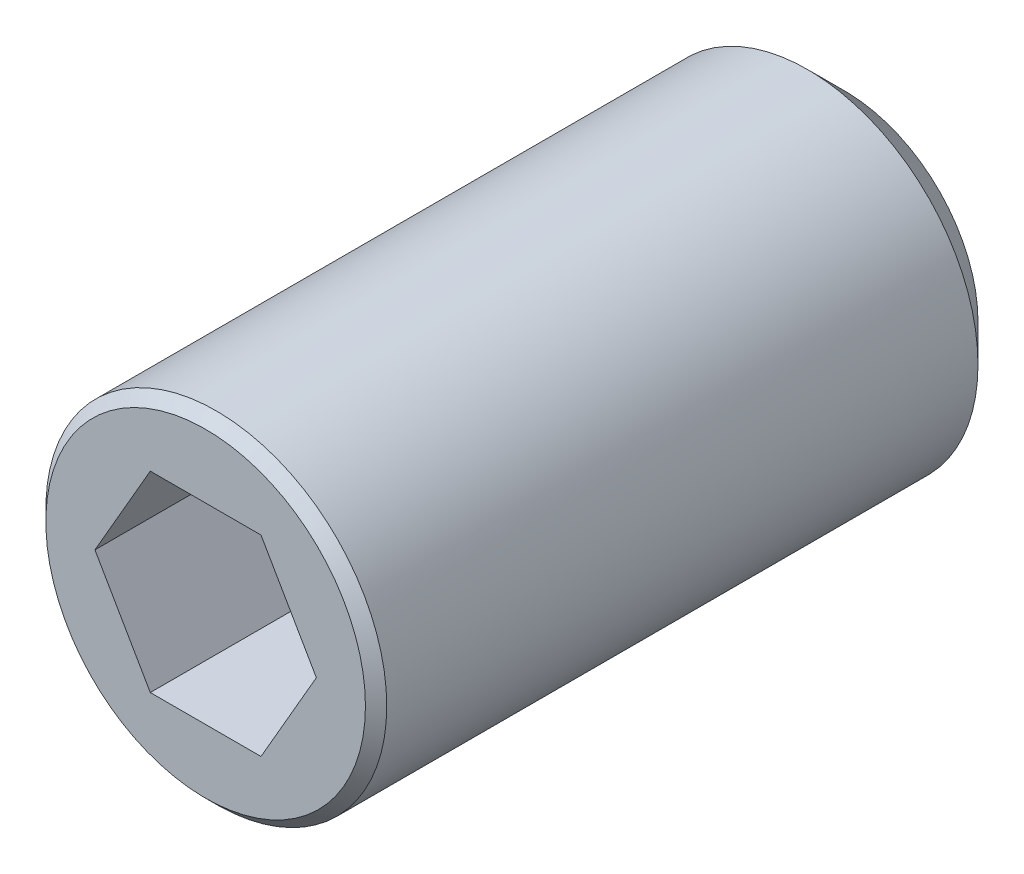
ISO-10303-21;
HEADER;
FILE_DESCRIPTION(('STEP AP214'),'2;1');
FILE_NAME('part.step','',(''),(''),'','','');
FILE_SCHEMA(('AUTOMOTIVE_DESIGN { 1 0 10303 214 1 1 1 1 }'));
ENDSEC;
DATA;
#1=APPLICATION_CONTEXT('core data for automotive mechanical design processes');
#2=APPLICATION_PROTOCOL_DEFINITION('international standard','automotive_design',2000,#1);
#3=PRODUCT_CONTEXT('',#1,'mechanical');
#4=PRODUCT('Part','Part','',(#3));
#5=PRODUCT_RELATED_PRODUCT_CATEGORY('part','',(#4));
#6=PRODUCT_DEFINITION_FORMATION('','',#4);
#7=PRODUCT_DEFINITION_CONTEXT('part definition',#1,'design');
#8=PRODUCT_DEFINITION('design','',#6,#7);
#9=PRODUCT_DEFINITION_SHAPE('','',#8);
#10=(LENGTH_UNIT() NAMED_UNIT(*) SI_UNIT(.MILLI.,.METRE.));
#11=(NAMED_UNIT(*) PLANE_ANGLE_UNIT() SI_UNIT($,.RADIAN.));
#12=(NAMED_UNIT(*) SI_UNIT($,.STERADIAN.) SOLID_ANGLE_UNIT());
#13=UNCERTAINTY_MEASURE_WITH_UNIT(LENGTH_MEASURE(1.E-05),#10,'distance_accuracy_value','');
#14=(GEOMETRIC_REPRESENTATION_CONTEXT(3) GLOBAL_UNCERTAINTY_ASSIGNED_CONTEXT((#13)) GLOBAL_UNIT_ASSIGNED_CONTEXT((#10,
#11,#12)) REPRESENTATION_CONTEXT('',''));
#15=CARTESIAN_POINT('',(0.,0.,0.));
#16=DIRECTION('',(0.,0.,1.));
#17=DIRECTION('',(1.,0.,0.));
#18=AXIS2_PLACEMENT_3D('',#15,#16,#17);
#19=CARTESIAN_POINT('',(0.,0.,15.));
#20=DIRECTION('',(0.,0.,-1.));
#21=DIRECTION('',(-1.,0.,0.));
#22=AXIS2_PLACEMENT_3D('',#19,#20,#21);
#23=CYLINDRICAL_SURFACE('',#22,8.);
#24=CARTESIAN_POINT('',(0.,0.,14.5));
#25=DIRECTION('',(0.,0.,1.));
#26=DIRECTION('',(1.,0.,0.));
#27=AXIS2_PLACEMENT_3D('',#24,#25,#26);
#28=CIRCLE('',#27,8.);
#29=CARTESIAN_POINT('',(8.,0.,14.5));
#30=VERTEX_POINT('',#29);
#31=EDGE_CURVE('E11',#30,#30,#28,.F.);
#32=ORIENTED_EDGE('',*,*,#31,.T.);
#33=EDGE_LOOP('',(#32));
#34=FACE_BOUND('',#33,.T.);
#35=CARTESIAN_POINT('',(0.,0.,-13.25));
#36=DIRECTION('',(0.,0.,1.));
#37=DIRECTION('',(1.,0.,0.));
#38=AXIS2_PLACEMENT_3D('',#35,#36,#37);
#39=CIRCLE('',#38,8.);
#40=CARTESIAN_POINT('',(8.,0.,-13.25));
#41=VERTEX_POINT('',#40);
#42=EDGE_CURVE('E118',#41,#41,#39,.T.);
#43=ORIENTED_EDGE('',*,*,#42,.T.);
#44=EDGE_LOOP('',(#43));
#45=FACE_BOUND('',#44,.T.);
#46=ADVANCED_FACE('F43',(#34,#45),#23,.T.);
#47=CARTESIAN_POINT('',(0.,0.,15.));
#48=DIRECTION('',(0.,0.,1.));
#49=DIRECTION('',(1.,0.,0.));
#50=AXIS2_PLACEMENT_3D('',#47,#48,#49);
#51=PLANE('',#50);
#52=CARTESIAN_POINT('',(0.,0.,15.));
#53=DIRECTION('',(0.,0.,1.));
#54=DIRECTION('',(1.,0.,0.));
#55=AXIS2_PLACEMENT_3D('',#52,#53,#54);
#56=CIRCLE('',#55,7.49999999999999);
#57=CARTESIAN_POINT('',(7.49999999999999,0.,15.));
#58=VERTEX_POINT('',#57);
#59=EDGE_CURVE('E51',#58,#58,#56,.T.);
#60=ORIENTED_EDGE('',*,*,#59,.T.);
#61=EDGE_LOOP('',(#60));
#62=FACE_BOUND('',#61,.T.);
#63=DIRECTION('',(-0.5,0.866025403784439,0.));
#64=VECTOR('',#63,1.);
#65=CARTESIAN_POINT('',(5.19615242270663,0.,15.));
#66=LINE('',#65,#64);
#67=CARTESIAN_POINT('',(5.19615242270663,0.,15.));
#68=VERTEX_POINT('',#67);
#69=CARTESIAN_POINT('',(2.59807621135332,4.5,15.));
#70=VERTEX_POINT('',#69);
#71=EDGE_CURVE('E58',#68,#70,#66,.T.);
#72=ORIENTED_EDGE('',*,*,#71,.F.);
#73=DIRECTION('',(0.5,0.866025403784439,0.));
#74=VECTOR('',#73,1.);
#75=CARTESIAN_POINT('',(2.59807621135332,-4.5,15.));
#76=LINE('',#75,#74);
#77=CARTESIAN_POINT('',(2.59807621135332,-4.5,15.));
#78=VERTEX_POINT('',#77);
#79=EDGE_CURVE('E93',#78,#68,#76,.T.);
#80=ORIENTED_EDGE('',*,*,#79,.F.);
#81=DIRECTION('',(1.,0.,0.));
#82=VECTOR('',#81,1.);
#83=CARTESIAN_POINT('',(-2.59807621135332,-4.5,15.));
#84=LINE('',#83,#82);
#85=CARTESIAN_POINT('',(-2.59807621135332,-4.5,15.));
#86=VERTEX_POINT('',#85);
#87=EDGE_CURVE('E101',#86,#78,#84,.T.);
#88=ORIENTED_EDGE('',*,*,#87,.F.);
#89=DIRECTION('',(0.5,-0.866025403784439,0.));
#90=VECTOR('',#89,1.);
#91=CARTESIAN_POINT('',(-5.19615242270663,0.,15.));
#92=LINE('',#91,#90);
#93=CARTESIAN_POINT('',(-5.19615242270663,0.,15.));
#94=VERTEX_POINT('',#93);
#95=EDGE_CURVE('E107',#94,#86,#92,.T.);
#96=ORIENTED_EDGE('',*,*,#95,.F.);
#97=DIRECTION('',(-0.5,-0.866025403784439,0.));
#98=VECTOR('',#97,1.);
#99=CARTESIAN_POINT('',(-2.59807621135332,4.5,15.));
#100=LINE('',#99,#98);
#101=CARTESIAN_POINT('',(-2.59807621135332,4.5,15.));
#102=VERTEX_POINT('',#101);
#103=EDGE_CURVE('E376',#102,#94,#100,.T.);
#104=ORIENTED_EDGE('',*,*,#103,.F.);
#105=DIRECTION('',(-1.,0.,0.));
#106=VECTOR('',#105,1.);
#107=CARTESIAN_POINT('',(2.59807621135332,4.5,15.));
#108=LINE('',#107,#106);
#109=EDGE_CURVE('E359',#70,#102,#108,.T.);
#110=ORIENTED_EDGE('',*,*,#109,.F.);
#111=EDGE_LOOP('',(#72,#80,#88,#96,#104,#110));
#112=FACE_BOUND('',#111,.T.);
#113=ADVANCED_FACE('F109',(#62,#112),#51,.T.);
#114=CARTESIAN_POINT('',(0.,0.,-15.));
#115=DIRECTION('',(0.,0.,1.));
#116=DIRECTION('',(1.,0.,0.));
#117=AXIS2_PLACEMENT_3D('',#114,#115,#116);
#118=PLANE('',#117);
#119=CARTESIAN_POINT('',(0.,0.,-15.));
#120=DIRECTION('',(0.,0.,1.));
#121=DIRECTION('',(1.,0.,0.));
#122=AXIS2_PLACEMENT_3D('',#119,#120,#121);
#123=CIRCLE('',#122,6.24999999999999);
#124=CARTESIAN_POINT('',(6.24999999999999,0.,-15.));
#125=VERTEX_POINT('',#124);
#126=EDGE_CURVE('E129',#125,#125,#123,.F.);
#127=ORIENTED_EDGE('',*,*,#126,.T.);
#128=EDGE_LOOP('',(#127));
#129=FACE_BOUND('',#128,.T.);
#130=ADVANCED_FACE('F151',(#129),#118,.F.);
#131=CARTESIAN_POINT('',(0.,0.,-13.25));
#132=DIRECTION('',(0.,0.,1.));
#133=DIRECTION('',(1.,0.,0.));
#134=AXIS2_PLACEMENT_3D('',#131,#132,#133);
#135=CONICAL_SURFACE('',#134,8.,0.785398163397443);
#136=ORIENTED_EDGE('',*,*,#126,.F.);
#137=EDGE_LOOP('',(#136));
#138=FACE_BOUND('',#137,.T.);
#139=ORIENTED_EDGE('',*,*,#42,.F.);
#140=EDGE_LOOP('',(#139));
#141=FACE_BOUND('',#140,.T.);
#142=ADVANCED_FACE('F155',(#138,#141),#135,.T.);
#143=CARTESIAN_POINT('',(5.19615242270663,0.,7.));
#144=DIRECTION('',(0.866025403784439,0.5,0.));
#145=DIRECTION('',(-0.5,0.866025403784439,0.));
#146=AXIS2_PLACEMENT_3D('',#143,#144,#145);
#147=PLANE('',#146);
#148=ORIENTED_EDGE('',*,*,#71,.T.);
#149=DIRECTION('',(0.,0.,1.));
#150=VECTOR('',#149,1.);
#151=CARTESIAN_POINT('',(2.59807621135332,4.5,7.));
#152=LINE('',#151,#150);
#153=CARTESIAN_POINT('',(2.59807621135332,4.5,7.));
#154=VERTEX_POINT('',#153);
#155=EDGE_CURVE('E125',#154,#70,#152,.T.);
#156=ORIENTED_EDGE('',*,*,#155,.F.);
#157=DIRECTION('',(-0.5,0.866025403784439,0.));
#158=VECTOR('',#157,1.);
#159=CARTESIAN_POINT('',(5.19615242270663,0.,7.));
#160=LINE('',#159,#158);
#161=CARTESIAN_POINT('',(5.19615242270663,0.,7.));
#162=VERTEX_POINT('',#161);
#163=EDGE_CURVE('E111',#162,#154,#160,.T.);
#164=ORIENTED_EDGE('',*,*,#163,.F.);
#165=DIRECTION('',(0.,0.,1.));
#166=VECTOR('',#165,1.);
#167=CARTESIAN_POINT('',(5.19615242270663,0.,7.));
#168=LINE('',#167,#166);
#169=EDGE_CURVE('E97',#162,#68,#168,.T.);
#170=ORIENTED_EDGE('',*,*,#169,.T.);
#171=EDGE_LOOP('',(#148,#156,#164,#170));
#172=FACE_BOUND('',#171,.T.);
#173=ADVANCED_FACE('F157',(#172),#147,.F.);
#174=CARTESIAN_POINT('',(2.59807621135332,-4.5,7.));
#175=DIRECTION('',(0.866025403784439,-0.5,0.));
#176=DIRECTION('',(0.5,0.866025403784439,0.));
#177=AXIS2_PLACEMENT_3D('',#174,#175,#176);
#178=PLANE('',#177);
#179=ORIENTED_EDGE('',*,*,#79,.T.);
#180=ORIENTED_EDGE('',*,*,#169,.F.);
#181=DIRECTION('',(0.5,0.866025403784439,0.));
#182=VECTOR('',#181,1.);
#183=CARTESIAN_POINT('',(2.59807621135332,-4.5,7.));
#184=LINE('',#183,#182);
#185=CARTESIAN_POINT('',(2.59807621135332,-4.5,7.));
#186=VERTEX_POINT('',#185);
#187=EDGE_CURVE('E95',#186,#162,#184,.T.);
#188=ORIENTED_EDGE('',*,*,#187,.F.);
#189=DIRECTION('',(0.,0.,1.));
#190=VECTOR('',#189,1.);
#191=CARTESIAN_POINT('',(2.59807621135332,-4.5,7.));
#192=LINE('',#191,#190);
#193=EDGE_CURVE('E88',#186,#78,#192,.T.);
#194=ORIENTED_EDGE('',*,*,#193,.T.);
#195=EDGE_LOOP('',(#179,#180,#188,#194));
#196=FACE_BOUND('',#195,.T.);
#197=ADVANCED_FACE('F90',(#196),#178,.F.);
#198=CARTESIAN_POINT('',(-2.59807621135332,-4.5,7.));
#199=DIRECTION('',(0.,-1.,0.));
#200=DIRECTION('',(1.,0.,0.));
#201=AXIS2_PLACEMENT_3D('',#198,#199,#200);
#202=PLANE('',#201);
#203=ORIENTED_EDGE('',*,*,#87,.T.);
#204=ORIENTED_EDGE('',*,*,#193,.F.);
#205=DIRECTION('',(1.,0.,0.));
#206=VECTOR('',#205,1.);
#207=CARTESIAN_POINT('',(-2.59807621135332,-4.5,7.));
#208=LINE('',#207,#206);
#209=CARTESIAN_POINT('',(-2.59807621135332,-4.5,7.));
#210=VERTEX_POINT('',#209);
#211=EDGE_CURVE('E67',#210,#186,#208,.T.);
#212=ORIENTED_EDGE('',*,*,#211,.F.);
#213=DIRECTION('',(0.,0.,1.));
#214=VECTOR('',#213,1.);
#215=CARTESIAN_POINT('',(-2.59807621135332,-4.5,7.));
#216=LINE('',#215,#214);
#217=EDGE_CURVE('E98',#210,#86,#216,.T.);
#218=ORIENTED_EDGE('',*,*,#217,.T.);
#219=EDGE_LOOP('',(#203,#204,#212,#218));
#220=FACE_BOUND('',#219,.T.);
#221=ADVANCED_FACE('F102',(#220),#202,.F.);
#222=CARTESIAN_POINT('',(-5.19615242270663,0.,7.));
#223=DIRECTION('',(-0.866025403784439,-0.5,0.));
#224=DIRECTION('',(0.5,-0.866025403784439,0.));
#225=AXIS2_PLACEMENT_3D('',#222,#223,#224);
#226=PLANE('',#225);
#227=ORIENTED_EDGE('',*,*,#95,.T.);
#228=ORIENTED_EDGE('',*,*,#217,.F.);
#229=DIRECTION('',(0.5,-0.866025403784439,0.));
#230=VECTOR('',#229,1.);
#231=CARTESIAN_POINT('',(-5.19615242270663,0.,7.));
#232=LINE('',#231,#230);
#233=CARTESIAN_POINT('',(-5.19615242270663,0.,7.));
#234=VERTEX_POINT('',#233);
#235=EDGE_CURVE('E366',#234,#210,#232,.T.);
#236=ORIENTED_EDGE('',*,*,#235,.F.);
#237=DIRECTION('',(0.,0.,1.));
#238=VECTOR('',#237,1.);
#239=CARTESIAN_POINT('',(-5.19615242270663,0.,7.));
#240=LINE('',#239,#238);
#241=EDGE_CURVE('E121',#234,#94,#240,.T.);
#242=ORIENTED_EDGE('',*,*,#241,.T.);
#243=EDGE_LOOP('',(#227,#228,#236,#242));
#244=FACE_BOUND('',#243,.T.);
#245=ADVANCED_FACE('F203',(#244),#226,.F.);
#246=CARTESIAN_POINT('',(-2.59807621135332,4.5,7.));
#247=DIRECTION('',(-0.866025403784439,0.5,0.));
#248=DIRECTION('',(-0.5,-0.866025403784439,0.));
#249=AXIS2_PLACEMENT_3D('',#246,#247,#248);
#250=PLANE('',#249);
#251=ORIENTED_EDGE('',*,*,#103,.T.);
#252=ORIENTED_EDGE('',*,*,#241,.F.);
#253=DIRECTION('',(-0.5,-0.866025403784439,0.));
#254=VECTOR('',#253,1.);
#255=CARTESIAN_POINT('',(-2.59807621135332,4.5,7.));
#256=LINE('',#255,#254);
#257=CARTESIAN_POINT('',(-2.59807621135332,4.5,7.));
#258=VERTEX_POINT('',#257);
#259=EDGE_CURVE('E355',#258,#234,#256,.T.);
#260=ORIENTED_EDGE('',*,*,#259,.F.);
#261=DIRECTION('',(0.,0.,1.));
#262=VECTOR('',#261,1.);
#263=CARTESIAN_POINT('',(-2.59807621135332,4.5,7.));
#264=LINE('',#263,#262);
#265=EDGE_CURVE('E123',#258,#102,#264,.T.);
#266=ORIENTED_EDGE('',*,*,#265,.T.);
#267=EDGE_LOOP('',(#251,#252,#260,#266));
#268=FACE_BOUND('',#267,.T.);
#269=ADVANCED_FACE('F212',(#268),#250,.F.);
#270=CARTESIAN_POINT('',(2.59807621135332,4.5,7.));
#271=DIRECTION('',(0.,1.,0.));
#272=DIRECTION('',(-1.,0.,0.));
#273=AXIS2_PLACEMENT_3D('',#270,#271,#272);
#274=PLANE('',#273);
#275=ORIENTED_EDGE('',*,*,#109,.T.);
#276=ORIENTED_EDGE('',*,*,#265,.F.);
#277=DIRECTION('',(-1.,0.,0.));
#278=VECTOR('',#277,1.);
#279=CARTESIAN_POINT('',(2.59807621135332,4.5,7.));
#280=LINE('',#279,#278);
#281=EDGE_CURVE('E114',#154,#258,#280,.T.);
#282=ORIENTED_EDGE('',*,*,#281,.F.);
#283=ORIENTED_EDGE('',*,*,#155,.T.);
#284=EDGE_LOOP('',(#275,#276,#282,#283));
#285=FACE_BOUND('',#284,.T.);
#286=ADVANCED_FACE('F222',(#285),#274,.F.);
#287=CARTESIAN_POINT('',(-2.59807621135332,-4.5,7.));
#288=CARTESIAN_POINT('',(-2.46817240078565,-4.275,6.5));
#289=CARTESIAN_POINT('',(0.,0.,6.5));
#290=CARTESIAN_POINT('',(2.59807621135332,-4.5,7.));
#291=CARTESIAN_POINT('',(2.46817240078565,-4.275,6.5));
#292=CARTESIAN_POINT('',(0.,0.,6.5));
#293=(BOUNDED_SURFACE() B_SPLINE_SURFACE(1,2,((#287,#288,#289),(#290,#291,#292)),.UNSPECIFIED.,
.F.,.F.,.F.) B_SPLINE_SURFACE_WITH_KNOTS((2,2),(3,3),(0.,1.),(0.,1.),
.UNSPECIFIED.) GEOMETRIC_REPRESENTATION_ITEM() RATIONAL_B_SPLINE_SURFACE(((1.,1.,1.),(1.,1.,1.))) REPRESENTATION_ITEM('') SURFACE());
#294=CARTESIAN_POINT('',(2.59807621135332,-4.5,7.));
#295=CARTESIAN_POINT('',(2.46817240078565,-4.275,6.5));
#296=CARTESIAN_POINT('',(0.,0.,6.5));
#297=(BOUNDED_CURVE() B_SPLINE_CURVE(2,(#294,#295,#296),.UNSPECIFIED.,.F.,
.F.) B_SPLINE_CURVE_WITH_KNOTS((3,3),(0.,1.),
.UNSPECIFIED.) CURVE() GEOMETRIC_REPRESENTATION_ITEM() RATIONAL_B_SPLINE_CURVE((1.,1.,1.)) REPRESENTATION_ITEM(''));
#298=CARTESIAN_POINT('',(0.,0.,6.5));
#299=VERTEX_POINT('',#298);
#300=EDGE_CURVE('E374',#186,#299,#297,.T.);
#301=CARTESIAN_POINT('',(-2.59807621135332,-4.5,7.));
#302=CARTESIAN_POINT('',(-2.46817240078565,-4.275,6.5));
#303=CARTESIAN_POINT('',(0.,0.,6.5));
#304=(BOUNDED_CURVE() B_SPLINE_CURVE(2,(#301,#302,#303),.UNSPECIFIED.,.F.,
.F.) B_SPLINE_CURVE_WITH_KNOTS((3,3),(0.,1.),
.UNSPECIFIED.) CURVE() GEOMETRIC_REPRESENTATION_ITEM() RATIONAL_B_SPLINE_CURVE((1.,1.,1.)) REPRESENTATION_ITEM(''));
#305=EDGE_CURVE('E381',#210,#299,#304,.T.);
#306=ORIENTED_EDGE('',*,*,#211,.T.);
#307=ORIENTED_EDGE('',*,*,#300,.T.);
#308=ORIENTED_EDGE('',*,*,#305,.F.);
#309=EDGE_LOOP('',(#306,#307,#308));
#310=FACE_BOUND('',#309,.T.);
#311=ADVANCED_FACE('F232',(#310),#293,.T.);
#312=CARTESIAN_POINT('',(-5.19615242270663,0.,7.));
#313=CARTESIAN_POINT('',(-4.9363448015713,0.,6.5));
#314=CARTESIAN_POINT('',(0.,0.,6.5));
#315=CARTESIAN_POINT('',(-2.59807621135332,-4.5,7.));
#316=CARTESIAN_POINT('',(-2.46817240078565,-4.275,6.5));
#317=CARTESIAN_POINT('',(0.,0.,6.5));
#318=(BOUNDED_SURFACE() B_SPLINE_SURFACE(1,2,((#312,#313,#314),(#315,#316,#317)),.UNSPECIFIED.,
.F.,.F.,.F.) B_SPLINE_SURFACE_WITH_KNOTS((2,2),(3,3),(0.,1.),(0.,1.),
.UNSPECIFIED.) GEOMETRIC_REPRESENTATION_ITEM() RATIONAL_B_SPLINE_SURFACE(((1.,1.,1.),(1.,1.,1.))) REPRESENTATION_ITEM('') SURFACE());
#319=CARTESIAN_POINT('',(-5.19615242270663,0.,7.));
#320=CARTESIAN_POINT('',(-4.9363448015713,0.,6.5));
#321=CARTESIAN_POINT('',(0.,0.,6.5));
#322=(BOUNDED_CURVE() B_SPLINE_CURVE(2,(#319,#320,#321),.UNSPECIFIED.,.F.,
.F.) B_SPLINE_CURVE_WITH_KNOTS((3,3),(0.,1.),
.UNSPECIFIED.) CURVE() GEOMETRIC_REPRESENTATION_ITEM() RATIONAL_B_SPLINE_CURVE((1.,1.,1.)) REPRESENTATION_ITEM(''));
#323=EDGE_CURVE('E382',#234,#299,#322,.T.);
#324=ORIENTED_EDGE('',*,*,#235,.T.);
#325=ORIENTED_EDGE('',*,*,#305,.T.);
#326=ORIENTED_EDGE('',*,*,#323,.F.);
#327=EDGE_LOOP('',(#324,#325,#326));
#328=FACE_BOUND('',#327,.T.);
#329=ADVANCED_FACE('F242',(#328),#318,.T.);
#330=CARTESIAN_POINT('',(-2.59807621135332,4.5,7.));
#331=CARTESIAN_POINT('',(-2.46817240078565,4.275,6.5));
#332=CARTESIAN_POINT('',(0.,0.,6.5));
#333=CARTESIAN_POINT('',(-5.19615242270663,0.,7.));
#334=CARTESIAN_POINT('',(-4.9363448015713,0.,6.5));
#335=CARTESIAN_POINT('',(0.,0.,6.5));
#336=(BOUNDED_SURFACE() B_SPLINE_SURFACE(1,2,((#330,#331,#332),(#333,#334,#335)),.UNSPECIFIED.,
.F.,.F.,.F.) B_SPLINE_SURFACE_WITH_KNOTS((2,2),(3,3),(0.,1.),(0.,1.),
.UNSPECIFIED.) GEOMETRIC_REPRESENTATION_ITEM() RATIONAL_B_SPLINE_SURFACE(((1.,1.,1.),(1.,1.,1.))) REPRESENTATION_ITEM('') SURFACE());
#337=CARTESIAN_POINT('',(-2.59807621135332,4.5,7.));
#338=CARTESIAN_POINT('',(-2.46817240078565,4.275,6.5));
#339=CARTESIAN_POINT('',(0.,0.,6.5));
#340=(BOUNDED_CURVE() B_SPLINE_CURVE(2,(#337,#338,#339),.UNSPECIFIED.,.F.,
.F.) B_SPLINE_CURVE_WITH_KNOTS((3,3),(0.,1.),
.UNSPECIFIED.) CURVE() GEOMETRIC_REPRESENTATION_ITEM() RATIONAL_B_SPLINE_CURVE((1.,1.,1.)) REPRESENTATION_ITEM(''));
#341=EDGE_CURVE('E349',#258,#299,#340,.T.);
#342=ORIENTED_EDGE('',*,*,#259,.T.);
#343=ORIENTED_EDGE('',*,*,#323,.T.);
#344=ORIENTED_EDGE('',*,*,#341,.F.);
#345=EDGE_LOOP('',(#342,#343,#344));
#346=FACE_BOUND('',#345,.T.);
#347=ADVANCED_FACE('F251',(#346),#336,.T.);
#348=CARTESIAN_POINT('',(2.59807621135332,-4.5,7.));
#349=CARTESIAN_POINT('',(2.46817240078565,-4.275,6.5));
#350=CARTESIAN_POINT('',(0.,0.,6.5));
#351=CARTESIAN_POINT('',(5.19615242270663,0.,7.));
#352=CARTESIAN_POINT('',(4.9363448015713,0.,6.5));
#353=CARTESIAN_POINT('',(0.,0.,6.5));
#354=(BOUNDED_SURFACE() B_SPLINE_SURFACE(1,2,((#348,#349,#350),(#351,#352,#353)),.UNSPECIFIED.,
.F.,.F.,.F.) B_SPLINE_SURFACE_WITH_KNOTS((2,2),(3,3),(0.,1.),(0.,1.),
.UNSPECIFIED.) GEOMETRIC_REPRESENTATION_ITEM() RATIONAL_B_SPLINE_SURFACE(((1.,1.,1.),(1.,1.,1.))) REPRESENTATION_ITEM('') SURFACE());
#355=CARTESIAN_POINT('',(5.19615242270663,0.,7.));
#356=CARTESIAN_POINT('',(4.9363448015713,0.,6.5));
#357=CARTESIAN_POINT('',(0.,0.,6.5));
#358=(BOUNDED_CURVE() B_SPLINE_CURVE(2,(#355,#356,#357),.UNSPECIFIED.,.F.,
.F.) B_SPLINE_CURVE_WITH_KNOTS((3,3),(0.,1.),
.UNSPECIFIED.) CURVE() GEOMETRIC_REPRESENTATION_ITEM() RATIONAL_B_SPLINE_CURVE((1.,1.,1.)) REPRESENTATION_ITEM(''));
#359=EDGE_CURVE('E388',#299,#162,#358,.F.);
#360=ORIENTED_EDGE('',*,*,#187,.T.);
#361=ORIENTED_EDGE('',*,*,#359,.F.);
#362=ORIENTED_EDGE('',*,*,#300,.F.);
#363=EDGE_LOOP('',(#360,#361,#362));
#364=FACE_BOUND('',#363,.T.);
#365=ADVANCED_FACE('F261',(#364),#354,.T.);
#366=CARTESIAN_POINT('',(2.59807621135332,4.5,7.));
#367=CARTESIAN_POINT('',(2.46817240078565,4.275,6.5));
#368=CARTESIAN_POINT('',(0.,0.,6.5));
#369=CARTESIAN_POINT('',(-2.59807621135332,4.5,7.));
#370=CARTESIAN_POINT('',(-2.46817240078565,4.275,6.5));
#371=CARTESIAN_POINT('',(0.,0.,6.5));
#372=(BOUNDED_SURFACE() B_SPLINE_SURFACE(1,2,((#366,#367,#368),(#369,#370,#371)),.UNSPECIFIED.,
.F.,.F.,.F.) B_SPLINE_SURFACE_WITH_KNOTS((2,2),(3,3),(0.,1.),(0.,1.),
.UNSPECIFIED.) GEOMETRIC_REPRESENTATION_ITEM() RATIONAL_B_SPLINE_SURFACE(((1.,1.,1.),(1.,1.,1.))) REPRESENTATION_ITEM('') SURFACE());
#373=CARTESIAN_POINT('',(2.59807621135332,4.5,7.));
#374=CARTESIAN_POINT('',(2.46817240078565,4.275,6.5));
#375=CARTESIAN_POINT('',(0.,0.,6.5));
#376=(BOUNDED_CURVE() B_SPLINE_CURVE(2,(#373,#374,#375),.UNSPECIFIED.,.F.,
.F.) B_SPLINE_CURVE_WITH_KNOTS((3,3),(0.,1.),
.UNSPECIFIED.) CURVE() GEOMETRIC_REPRESENTATION_ITEM() RATIONAL_B_SPLINE_CURVE((1.,1.,1.)) REPRESENTATION_ITEM(''));
#377=EDGE_CURVE('E352',#154,#299,#376,.T.);
#378=ORIENTED_EDGE('',*,*,#281,.T.);
#379=ORIENTED_EDGE('',*,*,#341,.T.);
#380=ORIENTED_EDGE('',*,*,#377,.F.);
#381=EDGE_LOOP('',(#378,#379,#380));
#382=FACE_BOUND('',#381,.T.);
#383=ADVANCED_FACE('F142',(#382),#372,.T.);
#384=CARTESIAN_POINT('',(5.19615242270663,0.,7.));
#385=CARTESIAN_POINT('',(4.9363448015713,0.,6.5));
#386=CARTESIAN_POINT('',(0.,0.,6.5));
#387=CARTESIAN_POINT('',(2.59807621135332,4.5,7.));
#388=CARTESIAN_POINT('',(2.46817240078565,4.275,6.5));
#389=CARTESIAN_POINT('',(0.,0.,6.5));
#390=(BOUNDED_SURFACE() B_SPLINE_SURFACE(1,2,((#384,#385,#386),(#387,#388,#389)),.UNSPECIFIED.,
.F.,.F.,.F.) B_SPLINE_SURFACE_WITH_KNOTS((2,2),(3,3),(0.,1.),(0.,1.),
.UNSPECIFIED.) GEOMETRIC_REPRESENTATION_ITEM() RATIONAL_B_SPLINE_SURFACE(((1.,1.,1.),(1.,1.,1.))) REPRESENTATION_ITEM('') SURFACE());
#391=ORIENTED_EDGE('',*,*,#163,.T.);
#392=ORIENTED_EDGE('',*,*,#377,.T.);
#393=ORIENTED_EDGE('',*,*,#359,.T.);
#394=EDGE_LOOP('',(#391,#392,#393));
#395=FACE_BOUND('',#394,.T.);
#396=ADVANCED_FACE('F136',(#395),#390,.T.);
#397=CARTESIAN_POINT('',(0.,0.,15.));
#398=DIRECTION('',(0.,0.,-1.));
#399=DIRECTION('',(-1.,0.,0.));
#400=AXIS2_PLACEMENT_3D('',#397,#398,#399);
#401=CONICAL_SURFACE('',#400,7.49999999999999,0.785398163397453);
#402=ORIENTED_EDGE('',*,*,#31,.F.);
#403=EDGE_LOOP('',(#402));
#404=FACE_BOUND('',#403,.T.);
#405=ORIENTED_EDGE('',*,*,#59,.F.);
#406=EDGE_LOOP('',(#405));
#407=FACE_BOUND('',#406,.T.);
#408=ADVANCED_FACE('F45',(#404,#407),#401,.T.);
#409=CLOSED_SHELL('',(#46,#113,#130,#142,#173,#197,#221,#245,#269,#286,#311,#329,#347,#365,#383,
#396,#408));
#410=MANIFOLD_SOLID_BREP('B2',#409);
#411=ADVANCED_BREP_SHAPE_REPRESENTATION('',(#18,#410),#14);
#412=SHAPE_DEFINITION_REPRESENTATION(#9,#411);
ENDSEC;
END-ISO-10303-21;
